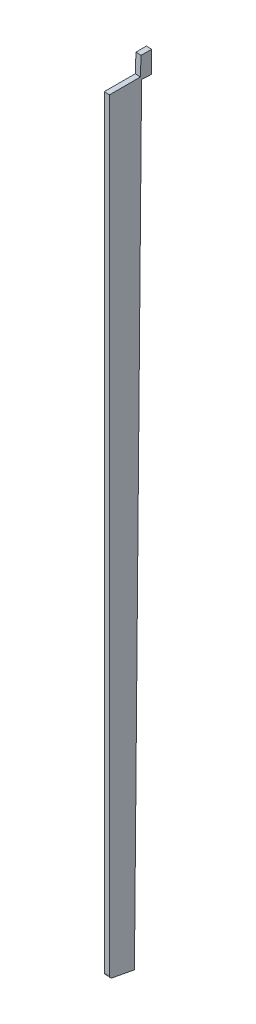
ISO-10303-21;
HEADER;
FILE_DESCRIPTION(('STEP AP214'),'2;1');
FILE_NAME('part.step','',(''),(''),'','','');
FILE_SCHEMA(('AUTOMOTIVE_DESIGN { 1 0 10303 214 1 1 1 1 }'));
ENDSEC;
DATA;
#1=APPLICATION_CONTEXT('core data for automotive mechanical design processes');
#2=APPLICATION_PROTOCOL_DEFINITION('international standard','automotive_design',2000,#1);
#3=PRODUCT_CONTEXT('',#1,'mechanical');
#4=PRODUCT('Part','Part','',(#3));
#5=PRODUCT_RELATED_PRODUCT_CATEGORY('part','',(#4));
#6=PRODUCT_DEFINITION_FORMATION('','',#4);
#7=PRODUCT_DEFINITION_CONTEXT('part definition',#1,'design');
#8=PRODUCT_DEFINITION('design','',#6,#7);
#9=PRODUCT_DEFINITION_SHAPE('','',#8);
#10=(LENGTH_UNIT() NAMED_UNIT(*) SI_UNIT(.MILLI.,.METRE.));
#11=(NAMED_UNIT(*) PLANE_ANGLE_UNIT() SI_UNIT($,.RADIAN.));
#12=(NAMED_UNIT(*) SI_UNIT($,.STERADIAN.) SOLID_ANGLE_UNIT());
#13=UNCERTAINTY_MEASURE_WITH_UNIT(LENGTH_MEASURE(1.E-05),#10,'distance_accuracy_value','');
#14=(GEOMETRIC_REPRESENTATION_CONTEXT(3) GLOBAL_UNCERTAINTY_ASSIGNED_CONTEXT((#13)) GLOBAL_UNIT_ASSIGNED_CONTEXT((#10,
#11,#12)) REPRESENTATION_CONTEXT('',''));
#15=CARTESIAN_POINT('',(0.,0.,0.));
#16=DIRECTION('',(0.,0.,1.));
#17=DIRECTION('',(1.,0.,0.));
#18=AXIS2_PLACEMENT_3D('',#15,#16,#17);
#19=CARTESIAN_POINT('',(184.5006852326,-42.1978786607,121.9738320219));
#20=DIRECTION('',(0.998629534754574,0.,0.0523359562429386));
#21=DIRECTION('',(0.0523359562429386,0.,-0.998629534754574));
#22=AXIS2_PLACEMENT_3D('',#19,#20,#21);
#23=PLANE('',#22);
#24=DIRECTION('',(-0.0522644276887088,-0.0522644276887069,0.997264688634238));
#25=VECTOR('',#24,1.);
#26=CARTESIAN_POINT('',(184.2909007959,34.3922746141211,125.976757533525));
#27=LINE('',#26,#25);
#28=CARTESIAN_POINT('',(184.705212005004,34.8065858232252,118.071228721351));
#29=VERTEX_POINT('',#28);
#30=CARTESIAN_POINT('',(184.656584669788,34.7579584880086,118.999093551379));
#31=VERTEX_POINT('',#30);
#32=EDGE_CURVE('E208',#29,#31,#27,.T.);
#33=ORIENTED_EDGE('',*,*,#32,.F.);
#34=CARTESIAN_POINT('',(184.705211997627,34.8066456225911,118.071228862116));
#35=CARTESIAN_POINT('',(184.705234977646,34.6071108074494,118.070790377229));
#36=CARTESIAN_POINT('',(184.705263006463,34.4075762538389,118.07025555554));
#37=CARTESIAN_POINT('',(184.705314498615,34.0575105145859,118.069273026767));
#38=CARTESIAN_POINT('',(184.705337392663,33.9069792995909,118.068836182293));
#39=CARTESIAN_POINT('',(184.705381483794,33.6059167784652,118.067994873399));
#40=CARTESIAN_POINT('',(184.705402680876,33.4553854723346,118.06759040898));
#41=CARTESIAN_POINT('',(184.705421429006,33.3048540388935,118.067232673347));
#42=B_SPLINE_CURVE_WITH_KNOTS('',3,(#34,#35,#36,#37,#38,#39,#40,#41),.UNSPECIFIED.,.F.,.F.,(4,2,
2,4),(0.,0.598605823472927,1.05020137048312,1.50179692528668),.UNSPECIFIED.);
#43=CARTESIAN_POINT('',(184.705412179008,33.3048539317987,118.067277259925));
#44=VERTEX_POINT('',#43);
#45=EDGE_CURVE('E155',#29,#44,#42,.T.);
#46=ORIENTED_EDGE('',*,*,#45,.T.);
#47=DIRECTION('',(0.000389339365391512,-0.999972328524379,-0.00742903764899957));
#48=VECTOR('',#47,1.);
#49=CARTESIAN_POINT('',(184.705416716509,33.3048562404193,118.067322593144));
#50=LINE('',#49,#48);
#51=CARTESIAN_POINT('',(184.705613281445,32.8,118.063571910736));
#52=VERTEX_POINT('',#51);
#53=EDGE_CURVE('E159',#44,#52,#50,.T.);
#54=ORIENTED_EDGE('',*,*,#53,.T.);
#55=DIRECTION('',(0.0523359562429386,0.,-0.998629534754574));
#56=VECTOR('',#55,1.);
#57=CARTESIAN_POINT('',(184.5006852326,32.8,121.9738320219));
#58=LINE('',#57,#56);
#59=CARTESIAN_POINT('',(184.659027233943,32.8,118.95248665086));
#60=VERTEX_POINT('',#59);
#61=EDGE_CURVE('E161',#60,#52,#58,.T.);
#62=ORIENTED_EDGE('',*,*,#61,.F.);
#63=DIRECTION('',(-0.000464096706949112,-0.999960681658663,0.0088554927016209));
#64=VECTOR('',#63,1.);
#65=CARTESIAN_POINT('',(184.659027233958,32.8000000318263,118.952486650578));
#66=LINE('',#65,#64);
#67=CARTESIAN_POINT('',(184.62601842434,-38.322055507033,119.582332258803));
#68=VERTEX_POINT('',#67);
#69=EDGE_CURVE('E107',#60,#68,#66,.T.);
#70=ORIENTED_EDGE('',*,*,#69,.T.);
#71=CARTESIAN_POINT('',(184.524971554996,-38.0394702416146,121.510421384624));
#72=CARTESIAN_POINT('',(184.536032859543,-38.0707885723955,121.299359120615));
#73=CARTESIAN_POINT('',(184.558266656468,-38.13338679984,120.875113002392));
#74=CARTESIAN_POINT('',(184.591986358834,-38.219733945,120.23170275249));
#75=CARTESIAN_POINT('',(184.61464127806,-38.2871350317664,119.799421142092));
#76=CARTESIAN_POINT('',(184.62601842434,-38.3220555070361,119.582332258796));
#77=(BOUNDED_CURVE() B_SPLINE_CURVE(3,(#71,#72,#73,#74,#75,#76),.UNSPECIFIED.,.F.,
.F.) B_SPLINE_CURVE_WITH_KNOTS((4,1,1,4),(0.02229358542885,0.3410378064515,0.6597820274743,
0.978526248497),
.UNSPECIFIED.) CURVE() GEOMETRIC_REPRESENTATION_ITEM() RATIONAL_B_SPLINE_CURVE((1.,1.,1.,1.,1.,1.)) REPRESENTATION_ITEM(''));
#78=CARTESIAN_POINT('',(184.524971554995,-38.0394702416151,121.510421384632));
#79=VERTEX_POINT('',#78);
#80=EDGE_CURVE('E102',#68,#79,#77,.F.);
#81=ORIENTED_EDGE('',*,*,#80,.T.);
#82=CARTESIAN_POINT('',(184.524971554995,-38.0394702416157,121.510421384639));
#83=CARTESIAN_POINT('',(184.522253685225,-38.0349571997024,121.562281429222));
#84=CARTESIAN_POINT('',(184.51756593088,-38.00267348749,121.651729110631));
#85=CARTESIAN_POINT('',(184.512202509703,-37.89652311706,121.754069283232));
#86=CARTESIAN_POINT('',(184.510688559446,-37.8009331648689,121.782957175014));
#87=CARTESIAN_POINT('',(184.510686590801,-37.7456221817474,121.782994738997));
#88=(BOUNDED_CURVE() B_SPLINE_CURVE(3,(#82,#83,#84,#85,#86,#87),.UNSPECIFIED.,.F.,
.F.) B_SPLINE_CURVE_WITH_KNOTS((4,1,1,4),(0.06048022871664,0.3576335045607,0.6547867804048,
0.9519400562488),
.UNSPECIFIED.) CURVE() GEOMETRIC_REPRESENTATION_ITEM() RATIONAL_B_SPLINE_CURVE((1.,1.,1.,1.,1.,1.)) REPRESENTATION_ITEM(''));
#89=CARTESIAN_POINT('',(184.510687975478,-37.7456221949012,121.782994811565));
#90=VERTEX_POINT('',#89);
#91=EDGE_CURVE('E24',#90,#79,#88,.F.);
#92=ORIENTED_EDGE('',*,*,#91,.F.);
#93=DIRECTION('',(0.,1.,0.));
#94=VECTOR('',#93,1.);
#95=CARTESIAN_POINT('',(184.510689360153,-2.416471475527,121.782994884154));
#96=LINE('',#95,#94);
#97=CARTESIAN_POINT('',(184.51068934373,32.9101379262714,121.782995197519));
#98=VERTEX_POINT('',#97);
#99=EDGE_CURVE('E97',#98,#90,#96,.F.);
#100=ORIENTED_EDGE('',*,*,#99,.F.);
#101=DIRECTION('',(0.0522648305395171,0.0513692926803632,-0.997311176743846));
#102=VECTOR('',#101,1.);
#103=CARTESIAN_POINT('',(184.510689335519,32.9101378941576,121.782995354203));
#104=LINE('',#103,#102);
#105=CARTESIAN_POINT('',(184.653439808862,33.050439894647,119.059087825459));
#106=VERTEX_POINT('',#105);
#107=EDGE_CURVE('E271',#98,#106,#104,.T.);
#108=ORIENTED_EDGE('',*,*,#107,.T.);
#109=DIRECTION('',(0.00184021471466072,0.999381640594566,-0.035113388505222));
#110=VECTOR('',#109,1.);
#111=CARTESIAN_POINT('',(184.655012573321,33.90418619002,119.02909093894));
#112=LINE('',#111,#110);
#113=EDGE_CURVE('E207',#31,#106,#112,.F.);
#114=ORIENTED_EDGE('',*,*,#113,.F.);
#115=EDGE_LOOP('',(#33,#46,#54,#62,#70,#81,#92,#100,#108,#114));
#116=FACE_BOUND('',#115,.T.);
#117=ADVANCED_FACE('F17',(#116),#23,.F.);
#118=CARTESIAN_POINT('',(184.7603418492,-2.416471475527,121.7960785146));
#119=DIRECTION('',(-0.0523355489657193,0.,0.998629556098986));
#120=DIRECTION('',(0.998629556098986,0.,0.0523355489657193));
#121=AXIS2_PLACEMENT_3D('',#118,#119,#120);
#122=PLANE('',#121);
#123=DIRECTION('',(-0.998629534754531,0.,-0.0523359562437616));
#124=VECTOR('',#123,1.);
#125=CARTESIAN_POINT('',(185.482121239688,-37.745622208055,121.833905471646));
#126=LINE('',#125,#124);
#127=CARTESIAN_POINT('',(185.010001366444,-37.7456221949012,121.809162559827));
#128=VERTEX_POINT('',#127);
#129=EDGE_CURVE('E116',#128,#90,#126,.T.);
#130=ORIENTED_EDGE('',*,*,#129,.F.);
#131=DIRECTION('',(0.,1.,0.));
#132=VECTOR('',#131,1.);
#133=CARTESIAN_POINT('',(185.010001391173,-42.1978786607,121.809162087966));
#134=LINE('',#133,#132);
#135=CARTESIAN_POINT('',(185.010001391717,32.9101383063397,121.809162077587));
#136=VERTEX_POINT('',#135);
#137=EDGE_CURVE('E189',#136,#128,#134,.F.);
#138=ORIENTED_EDGE('',*,*,#137,.F.);
#139=DIRECTION('',(-0.998629653231954,-1.60031987662425E-08,-0.052333695510889));
#140=VECTOR('',#139,1.);
#141=CARTESIAN_POINT('',(185.010004162132,32.9101379021592,121.809162201958));
#142=LINE('',#141,#140);
#143=EDGE_CURVE('E272',#136,#98,#142,.T.);
#144=ORIENTED_EDGE('',*,*,#143,.T.);
#145=ORIENTED_EDGE('',*,*,#99,.T.);
#146=EDGE_LOOP('',(#130,#138,#144,#145));
#147=FACE_BOUND('',#146,.T.);
#148=ADVANCED_FACE('F142',(#147),#122,.T.);
#149=CARTESIAN_POINT('',(185.4981130124,-38.04076377608,121.5287642707));
#150=CARTESIAN_POINT('',(185.4975280441,-38.04082561209,121.5399261308));
#151=CARTESIAN_POINT('',(185.4941653883,-38.03824258549,121.6040894249));
#152=CARTESIAN_POINT('',(185.4890005798,-38.00267348749,121.7026398433));
#153=CARTESIAN_POINT('',(185.4836371586,-37.89652311706,121.8049800159));
#154=CARTESIAN_POINT('',(185.4820007793,-37.79320306714,121.8362039924));
#155=CARTESIAN_POINT('',(185.4821403524,-37.72753418651,121.8335407795));
#156=CARTESIAN_POINT('',(185.4821805466,-37.71818973948,121.8327738279));
#157=(BOUNDED_CURVE() B_SPLINE_CURVE(3,(#149,#150,#151,#152,#153,#154,#155,#156),.UNSPECIFIED.,
.F.,.F.) B_SPLINE_CURVE_WITH_KNOTS((4,1,1,1,1,4),(0.,0.06048022871664,0.3576335045607,
0.6547867804048,0.9519400562488,1.),
.UNSPECIFIED.) CURVE() GEOMETRIC_REPRESENTATION_ITEM() RATIONAL_B_SPLINE_CURVE((1.,1.,1.,1.,1.,
1.,1.,1.)) REPRESENTATION_ITEM(''));
#158=DIRECTION('',(-0.998629534754531,0.,-0.0523359562437616));
#159=VECTOR('',#158,1.);
#160=SURFACE_OF_LINEAR_EXTRUSION('',#157,#159);
#161=DIRECTION('',(-0.998629534754072,0.,-0.0523359562525186));
#162=VECTOR('',#161,1.);
#163=CARTESIAN_POINT('',(185.496405624474,-38.0394702416035,121.561332087009));
#164=LINE('',#163,#162);
#165=CARTESIAN_POINT('',(185.024286322392,-38.0394702416091,121.536589362789));
#166=VERTEX_POINT('',#165);
#167=EDGE_CURVE('E111',#79,#166,#164,.F.);
#168=ORIENTED_EDGE('',*,*,#167,.T.);
#169=CARTESIAN_POINT('',(185.024286322394,-38.0394702416157,121.536589362762));
#170=CARTESIAN_POINT('',(185.021568452624,-38.0349571997024,121.588449407345));
#171=CARTESIAN_POINT('',(185.016880698279,-38.00267348749,121.677897088754));
#172=CARTESIAN_POINT('',(185.011517277102,-37.89652311706,121.780237261355));
#173=CARTESIAN_POINT('',(185.010003326845,-37.8009331648689,121.809125153137));
#174=CARTESIAN_POINT('',(185.0100013582,-37.7456221817474,121.80916271712));
#175=(BOUNDED_CURVE() B_SPLINE_CURVE(3,(#169,#170,#171,#172,#173,#174),.UNSPECIFIED.,.F.,
.F.) B_SPLINE_CURVE_WITH_KNOTS((4,1,1,4),(0.06048022871664,0.3576335045607,0.6547867804048,
0.9519400562488),
.UNSPECIFIED.) CURVE() GEOMETRIC_REPRESENTATION_ITEM() RATIONAL_B_SPLINE_CURVE((1.,1.,1.,1.,1.,1.)) REPRESENTATION_ITEM(''));
#176=EDGE_CURVE('E187',#128,#166,#175,.F.);
#177=ORIENTED_EDGE('',*,*,#176,.F.);
#178=ORIENTED_EDGE('',*,*,#129,.T.);
#179=ORIENTED_EDGE('',*,*,#91,.T.);
#180=EDGE_LOOP('',(#168,#177,#178,#179));
#181=FACE_BOUND('',#180,.T.);
#182=ADVANCED_FACE('F113',(#181),#160,.T.);
#183=CARTESIAN_POINT('',(185.4940854914,-38.03289899023,121.6056028629));
#184=CARTESIAN_POINT('',(185.4948585985,-38.03508921872,121.5908511011));
#185=CARTESIAN_POINT('',(185.5066893917,-38.06859945203,121.3651061187));
#186=CARTESIAN_POINT('',(185.5297007259,-38.13338679984,120.9260237047));
#187=CARTESIAN_POINT('',(185.5634204283,-38.219733945,120.2826134548));
#188=CARTESIAN_POINT('',(185.5868384768,-38.28940543244,119.83577047));
#189=CARTESIAN_POINT('',(185.5989856727,-38.32676621855,119.6039881655));
#190=CARTESIAN_POINT('',(185.5997526022,-38.32912950076,119.5893542787));
#191=(BOUNDED_CURVE() B_SPLINE_CURVE(3,(#183,#184,#185,#186,#187,#188,#189,#190),.UNSPECIFIED.,
.F.,.F.) B_SPLINE_CURVE_WITH_KNOTS((4,1,1,1,1,4),(0.,0.02229358542885,0.3410378064515,
0.6597820274743,0.978526248497,1.),
.UNSPECIFIED.) CURVE() GEOMETRIC_REPRESENTATION_ITEM() RATIONAL_B_SPLINE_CURVE((1.,1.,1.,1.,1.,
1.,1.,1.)) REPRESENTATION_ITEM(''));
#192=DIRECTION('',(-0.998629534754072,0.,-0.0523359562525186));
#193=VECTOR('',#192,1.);
#194=SURFACE_OF_LINEAR_EXTRUSION('',#191,#193);
#195=ORIENTED_EDGE('',*,*,#80,.F.);
#196=DIRECTION('',(0.998629534754575,0.,0.0523359562429296));
#197=VECTOR('',#196,1.);
#198=CARTESIAN_POINT('',(184.875675808098,-38.3220555070299,119.595416247876));
#199=LINE('',#198,#197);
#200=CARTESIAN_POINT('',(185.125333191736,-38.3220555070299,119.608500236968));
#201=VERTEX_POINT('',#200);
#202=EDGE_CURVE('E122',#68,#201,#199,.T.);
#203=ORIENTED_EDGE('',*,*,#202,.T.);
#204=CARTESIAN_POINT('',(185.024286322394,-38.0394702416146,121.536589362751));
#205=CARTESIAN_POINT('',(185.035347626942,-38.0707885723955,121.325527098742));
#206=CARTESIAN_POINT('',(185.057581423867,-38.13338679984,120.901280980519));
#207=CARTESIAN_POINT('',(185.091301126232,-38.219733945,120.257870730617));
#208=CARTESIAN_POINT('',(185.113956045458,-38.2871350317664,119.82558912022));
#209=CARTESIAN_POINT('',(185.125333191739,-38.3220555070361,119.608500236923));
#210=(BOUNDED_CURVE() B_SPLINE_CURVE(3,(#204,#205,#206,#207,#208,#209),.UNSPECIFIED.,.F.,
.F.) B_SPLINE_CURVE_WITH_KNOTS((4,1,1,4),(0.02229358542885,0.3410378064515,0.6597820274743,
0.978526248497),
.UNSPECIFIED.) CURVE() GEOMETRIC_REPRESENTATION_ITEM() RATIONAL_B_SPLINE_CURVE((1.,1.,1.,1.,1.,1.)) REPRESENTATION_ITEM(''));
#211=EDGE_CURVE('E119',#166,#201,#210,.T.);
#212=ORIENTED_EDGE('',*,*,#211,.F.);
#213=ORIENTED_EDGE('',*,*,#167,.F.);
#214=EDGE_LOOP('',(#195,#203,#212,#213));
#215=FACE_BOUND('',#214,.T.);
#216=ADVANCED_FACE('F117',(#215),#194,.F.);
#217=CARTESIAN_POINT('',(184.8921802129,-2.761027753517,119.2804934439));
#218=DIRECTION('',(-0.0523338984799378,0.00886764550158963,0.998590270297658));
#219=DIRECTION('',(0.998629534754575,0.,0.0523359562429296));
#220=AXIS2_PLACEMENT_3D('',#217,#218,#219);
#221=PLANE('',#220);
#222=ORIENTED_EDGE('',*,*,#69,.F.);
#223=DIRECTION('',(-0.998629534754575,0.,-0.0523359562429296));
#224=VECTOR('',#223,1.);
#225=CARTESIAN_POINT('',(184.908675023292,32.8,118.965570137103));
#226=LINE('',#225,#224);
#227=CARTESIAN_POINT('',(185.158342095264,32.8,118.978652836855));
#228=VERTEX_POINT('',#227);
#229=EDGE_CURVE('E166',#228,#60,#226,.T.);
#230=ORIENTED_EDGE('',*,*,#229,.F.);
#231=DIRECTION('',(0.000464099347821621,0.999960681211183,-0.0088555430924672));
#232=VECTOR('',#231,1.);
#233=CARTESIAN_POINT('',(185.125333191735,-38.32205550703,119.608500237002));
#234=LINE('',#233,#232);
#235=EDGE_CURVE('E177',#201,#228,#234,.T.);
#236=ORIENTED_EDGE('',*,*,#235,.F.);
#237=ORIENTED_EDGE('',*,*,#202,.F.);
#238=EDGE_LOOP('',(#222,#230,#236,#237));
#239=FACE_BOUND('',#238,.T.);
#240=ADVANCED_FACE('F178',(#239),#221,.F.);
#241=CARTESIAN_POINT('',(184.9319968596,32.8,118.5205629907));
#242=DIRECTION('',(0.,-1.,0.));
#243=DIRECTION('',(0.,0.,-1.));
#244=AXIS2_PLACEMENT_3D('',#241,#242,#243);
#245=PLANE('',#244);
#246=DIRECTION('',(0.998629534754575,0.,0.0523359562429131));
#247=VECTOR('',#246,1.);
#248=CARTESIAN_POINT('',(184.705602833475,32.8,118.063571380626));
#249=LINE('',#248,#247);
#250=CARTESIAN_POINT('',(185.204928048844,32.8,118.089739888859));
#251=VERTEX_POINT('',#250);
#252=EDGE_CURVE('E157',#52,#251,#249,.T.);
#253=ORIENTED_EDGE('',*,*,#252,.T.);
#254=DIRECTION('',(0.0523359562429386,0.,-0.998629534754574));
#255=VECTOR('',#254,1.);
#256=CARTESIAN_POINT('',(185.,32.8,122.));
#257=LINE('',#256,#255);
#258=EDGE_CURVE('E182',#228,#251,#257,.T.);
#259=ORIENTED_EDGE('',*,*,#258,.F.);
#260=ORIENTED_EDGE('',*,*,#229,.T.);
#261=ORIENTED_EDGE('',*,*,#61,.T.);
#262=EDGE_LOOP('',(#253,#259,#260,#261));
#263=FACE_BOUND('',#262,.T.);
#264=ADVANCED_FACE('F231',(#263),#245,.T.);
#265=CARTESIAN_POINT('',(184.9551723842,33.05242549471,118.0785312128));
#266=DIRECTION('',(-0.0523345080297926,-0.00743923285909537,0.998601901201749));
#267=DIRECTION('',(0.998629534754575,0.,0.0523359562429299));
#268=AXIS2_PLACEMENT_3D('',#265,#266,#267);
#269=PLANE('',#268);
#270=ORIENTED_EDGE('',*,*,#53,.F.);
#271=CARTESIAN_POINT('',(185.204196270015,33.304822060983,118.09621442017));
#272=CARTESIAN_POINT('',(185.1834546616,33.3048227812804,118.095212920198));
#273=CARTESIAN_POINT('',(185.162716045227,33.3048236498265,118.094152182472));
#274=CARTESIAN_POINT('',(185.121211269626,33.3048256209361,118.091936090922));
#275=CARTESIAN_POINT('',(185.100445118143,33.3048267238641,118.090780591486));
#276=CARTESIAN_POINT('',(185.058892821848,33.304829099966,118.088400765109));
#277=CARTESIAN_POINT('',(185.038106681537,33.3048303733344,118.087176360477));
#278=CARTESIAN_POINT('',(184.996521870486,33.3048330267631,118.084684422748));
#279=CARTESIAN_POINT('',(184.975723201592,33.3048344069,118.083416859018));
#280=CARTESIAN_POINT('',(184.934120817945,33.3048372101856,118.08086435341));
#281=CARTESIAN_POINT('',(184.913317103501,33.3048386333468,118.079579406548));
#282=CARTESIAN_POINT('',(184.871712110347,33.3048414589702,118.077017897471));
#283=CARTESIAN_POINT('',(184.850910831709,33.3048428614353,118.075741334097));
#284=CARTESIAN_POINT('',(184.809318176381,33.3048455818789,118.073222385249));
#285=CARTESIAN_POINT('',(184.788526800868,33.3048468999055,118.071979980561));
#286=CARTESIAN_POINT('',(184.746961454979,33.3048493876931,118.069555140487));
#287=CARTESIAN_POINT('',(184.726187488021,33.3048505576013,118.068372646297));
#288=CARTESIAN_POINT('',(184.705411134287,33.3048516225367,118.067232102098));
#289=B_SPLINE_CURVE_WITH_KNOTS('',3,(#271,#272,#273,#274,#275,#276,#277,#278,#279,#280,#281,
#282,#283,#284,#285,#286,#287,#288),.UNSPECIFIED.,.F.,.F.,(4,2,2,2,2,2,2,2,4),(0.,
0.0622970467911405,0.124691681322449,0.18715813351373,0.249669888622733,0.312199967561254,
0.374721204234902,0.437206521685863,0.49962927045745),.UNSPECIFIED.);
#290=CARTESIAN_POINT('',(185.204383147633,33.3048387861642,118.094918900468));
#291=VERTEX_POINT('',#290);
#292=EDGE_CURVE('E212',#44,#291,#289,.F.);
#293=ORIENTED_EDGE('',*,*,#292,.T.);
#294=DIRECTION('',(-0.000389339365394646,0.999972328524379,0.00742903764900935));
#295=VECTOR('',#294,1.);
#296=CARTESIAN_POINT('',(185.204829767854,33.05242549471,118.091615201859));
#297=LINE('',#296,#295);
#298=EDGE_CURVE('E252',#251,#291,#297,.T.);
#299=ORIENTED_EDGE('',*,*,#298,.F.);
#300=ORIENTED_EDGE('',*,*,#252,.F.);
#301=EDGE_LOOP('',(#270,#293,#299,#300));
#302=FACE_BOUND('',#301,.T.);
#303=ADVANCED_FACE('F227',(#302),#269,.F.);
#304=CARTESIAN_POINT('',(185.2486398795,33.26085980376,118.0975058191));
#305=CARTESIAN_POINT('',(185.0724304309,33.26085367511,118.0898207897));
#306=CARTESIAN_POINT('',(184.8759014686,33.26086012844,118.0761472513));
#307=CARTESIAN_POINT('',(184.6802830875,33.26085809907,118.0657825965));
#308=CARTESIAN_POINT('',(184.6613423377,33.26085783688,118.0648042599));
#309=CARTESIAN_POINT('',(185.2486986428,33.27552398018,118.0977813673));
#310=CARTESIAN_POINT('',(185.0724981141,33.27551885776,118.0900865674));
#311=CARTESIAN_POINT('',(184.8759109476,33.27552670037,118.0762407603));
#312=CARTESIAN_POINT('',(184.6802779833,33.27552588398,118.0658072816));
#313=CARTESIAN_POINT('',(184.6613361582,33.27552573793,118.0648230788));
#314=CARTESIAN_POINT('',(185.2507332518,33.79073385867,118.1068203365));
#315=CARTESIAN_POINT('',(185.0748412007,33.79076449938,118.0986769995));
#316=CARTESIAN_POINT('',(184.8762384872,33.7908186946,118.0794083799));
#317=CARTESIAN_POINT('',(184.68010023,33.79085990343,118.0667084001));
#318=CARTESIAN_POINT('',(184.6611211436,33.79086379451,118.0655290758));
#319=CARTESIAN_POINT('',(185.250737814,34.32067872948,118.086299945));
#320=CARTESIAN_POINT('',(185.0748207196,34.3207645627,118.0728072735));
#321=CARTESIAN_POINT('',(184.876192607,34.32075627902,118.0772003106));
#322=CARTESIAN_POINT('',(184.6800274577,34.32081419642,118.0692063825));
#323=CARTESIAN_POINT('',(184.661045755,34.32082031843,118.0683362693));
#324=CARTESIAN_POINT('',(185.2487173427,34.83580324316,118.1001249778));
#325=CARTESIAN_POINT('',(185.0724439315,34.83591765818,118.0869685599));
#326=CARTESIAN_POINT('',(184.8757768082,34.83599866182,118.0812451478));
#327=CARTESIAN_POINT('',(184.6800634115,34.83610893517,118.0698551658));
#328=CARTESIAN_POINT('',(184.661113792,34.83611984276,118.0687080897));
#329=CARTESIAN_POINT('',(185.2486591458,34.85042458054,118.1005375824));
#330=CARTESIAN_POINT('',(185.072375482,34.85053979219,118.087394019));
#331=CARTESIAN_POINT('',(184.8757648507,34.85062341778,118.0813636588));
#332=CARTESIAN_POINT('',(184.6800644766,34.8507351983,118.069872517));
#333=CARTESIAN_POINT('',(184.6611157823,34.85074624326,118.0687172342));
#334=B_SPLINE_SURFACE_WITH_KNOTS('',3,3,((#304,#305,#306,#307,#308),(#309,#310,#311,#312,#313),
(#314,#315,#316,#317,#318),(#319,#320,#321,#322,#323),(#324,#325,#326,#327,#328),(#329,#330,
#331,#332,#333)),.UNSPECIFIED.,.F.,.F.,.F.,(4,1,1,4),(4,1,4),(-0.02929413289653,
6.64995310578E-06,1.000151973221,1.029369678217),(-0.09467557252025,0.974218853325,
1.088857010258),.UNSPECIFIED.);
#335=CARTESIAN_POINT('',(185.204304714584,34.806646909622,118.096216262626));
#336=CARTESIAN_POINT('',(185.154524900832,34.8066849619756,118.092879336734));
#337=CARTESIAN_POINT('',(185.104715081614,34.8066922535285,118.09012940147));
#338=CARTESIAN_POINT('',(185.005068028009,34.806676830193,118.085202223755));
#339=CARTESIAN_POINT('',(184.955230794836,34.8066541165397,118.083024957735));
#340=CARTESIAN_POINT('',(184.838651536997,34.8066027463983,118.077898190605));
#341=CARTESIAN_POINT('',(184.771909939911,34.8065746876972,118.074937274121));
#342=CARTESIAN_POINT('',(184.705205988211,34.8065858237183,118.071228396589));
#343=B_SPLINE_CURVE_WITH_KNOTS('',3,(#335,#336,#337,#338,#339,#340,#341,#342),.UNSPECIFIED.,.F.,
.F.,(4,2,2,4),(0.,0.149658648957129,0.299311137933607,0.499729542112413),.UNSPECIFIED.);
#344=CARTESIAN_POINT('',(185.204264117046,34.8065867450851,118.096820943178));
#345=VERTEX_POINT('',#344);
#346=EDGE_CURVE('E210',#345,#29,#343,.T.);
#347=CARTESIAN_POINT('',(185.204587745424,33.3048188482719,118.09623326493));
#348=CARTESIAN_POINT('',(185.204427927384,33.5043851805707,118.099282774808));
#349=CARTESIAN_POINT('',(185.204499382184,33.7039438827741,118.097919335988));
#350=CARTESIAN_POINT('',(185.204678896795,34.0540047677209,118.094493993163));
#351=CARTESIAN_POINT('',(185.204773642482,34.2045085320255,118.092686137751));
#352=CARTESIAN_POINT('',(185.204826324324,34.5055416879764,118.091680908321));
#353=CARTESIAN_POINT('',(185.204784236477,34.6560710794871,118.092483992281));
#354=CARTESIAN_POINT('',(185.204587700395,34.8066017848063,118.096234124127));
#355=B_SPLINE_CURVE_WITH_KNOTS('',3,(#347,#348,#349,#350,#351,#352,#353,#354),.UNSPECIFIED.,.F.,
.F.,(4,2,2,4),(0.,0.59868012816035,1.05020901306683,1.50181710362485),.UNSPECIFIED.);
#356=EDGE_CURVE('E247',#291,#345,#355,.T.);
#357=ORIENTED_EDGE('',*,*,#45,.F.);
#358=ORIENTED_EDGE('',*,*,#346,.F.);
#359=ORIENTED_EDGE('',*,*,#356,.F.);
#360=ORIENTED_EDGE('',*,*,#292,.F.);
#361=EDGE_LOOP('',(#357,#358,#359,#360));
#362=FACE_BOUND('',#361,.T.);
#363=ADVANCED_FACE('F19',(#362),#334,.F.);
#364=CARTESIAN_POINT('',(184.9304034694,34.78211990396,118.5511502601));
#365=DIRECTION('',(-0.00273530880057787,0.998633280838553,0.0521928011069875));
#366=DIRECTION('',(0.,-0.0521929963591139,0.998637016703796));
#367=AXIS2_PLACEMENT_3D('',#364,#365,#366);
#368=PLANE('',#367);
#369=DIRECTION('',(-0.998629534754575,0.,-0.052335956242926));
#370=VECTOR('',#369,1.);
#371=CARTESIAN_POINT('',(184.906242053466,34.7579584880086,119.012177540439));
#372=LINE('',#371,#370);
#373=CARTESIAN_POINT('',(185.155899423743,34.7579584745648,119.025261786024));
#374=VERTEX_POINT('',#373);
#375=EDGE_CURVE('E201',#374,#31,#372,.T.);
#376=ORIENTED_EDGE('',*,*,#375,.F.);
#377=DIRECTION('',(-0.0522644276887088,-0.0522644276887069,0.997264688634238));
#378=VECTOR('',#377,1.);
#379=CARTESIAN_POINT('',(184.7902155633,34.3922746141223,126.002925511625));
#380=LINE('',#379,#378);
#381=EDGE_CURVE('E239',#345,#374,#380,.T.);
#382=ORIENTED_EDGE('',*,*,#381,.F.);
#383=ORIENTED_EDGE('',*,*,#346,.T.);
#384=ORIENTED_EDGE('',*,*,#32,.T.);
#385=EDGE_LOOP('',(#376,#382,#383,#384));
#386=FACE_BOUND('',#385,.T.);
#387=ADVANCED_FACE('F219',(#386),#368,.T.);
#388=CARTESIAN_POINT('',(184.904669957,33.90418619002,119.042174928));
#389=DIRECTION('',(-0.0523035938121408,0.0351615762234105,0.998012022789215));
#390=DIRECTION('',(0.998629534754575,0.,0.052335956242926));
#391=AXIS2_PLACEMENT_3D('',#388,#389,#390);
#392=PLANE('',#391);
#393=DIRECTION('',(0.998629625207778,-1.15407822183458E-08,0.052334230264442));
#394=VECTOR('',#393,1.);
#395=CARTESIAN_POINT('',(184.65343772301,33.0504403426876,119.059087884536));
#396=LINE('',#395,#394);
#397=CARTESIAN_POINT('',(185.152753222549,33.0504396007945,119.085255139655));
#398=VERTEX_POINT('',#397);
#399=EDGE_CURVE('E41',#106,#398,#396,.T.);
#400=ORIENTED_EDGE('',*,*,#399,.T.);
#401=DIRECTION('',(-0.00184018736444522,-0.999381658980868,0.0351128666319179));
#402=VECTOR('',#401,1.);
#403=CARTESIAN_POINT('',(185.155899397277,34.75795138906,119.02526229102));
#404=LINE('',#403,#402);
#405=EDGE_CURVE('E32',#374,#398,#404,.T.);
#406=ORIENTED_EDGE('',*,*,#405,.F.);
#407=ORIENTED_EDGE('',*,*,#375,.T.);
#408=ORIENTED_EDGE('',*,*,#113,.T.);
#409=EDGE_LOOP('',(#400,#406,#407,#408));
#410=FACE_BOUND('',#409,.T.);
#411=ADVANCED_FACE('F224',(#410),#392,.T.);
#412=CARTESIAN_POINT('',(184.8317042143,32.98027678874,120.434364277));
#413=DIRECTION('',(0.00268836088190792,-0.998679726323469,-0.0512988980997584));
#414=DIRECTION('',(0.,0.0512990834766219,-0.99868333521415));
#415=AXIS2_PLACEMENT_3D('',#412,#413,#414);
#416=PLANE('',#415);
#417=ORIENTED_EDGE('',*,*,#107,.F.);
#418=ORIENTED_EDGE('',*,*,#143,.F.);
#419=DIRECTION('',(-0.0522668607641804,-0.0513684358393801,0.997311114479967));
#420=VECTOR('',#419,1.);
#421=CARTESIAN_POINT('',(185.152755309705,33.05043860294,119.085255055738));
#422=LINE('',#421,#420);
#423=EDGE_CURVE('E11',#398,#136,#422,.T.);
#424=ORIENTED_EDGE('',*,*,#423,.F.);
#425=ORIENTED_EDGE('',*,*,#399,.F.);
#426=EDGE_LOOP('',(#417,#418,#424,#425));
#427=FACE_BOUND('',#426,.T.);
#428=ADVANCED_FACE('F262',(#427),#416,.F.);
#429=CARTESIAN_POINT('',(185.,-42.1978786607,122.));
#430=DIRECTION('',(0.998629534754574,0.,0.0523359562429386));
#431=DIRECTION('',(0.0523359562429386,0.,-0.998629534754574));
#432=AXIS2_PLACEMENT_3D('',#429,#430,#431);
#433=PLANE('',#432);
#434=ORIENTED_EDGE('',*,*,#405,.T.);
#435=ORIENTED_EDGE('',*,*,#423,.T.);
#436=ORIENTED_EDGE('',*,*,#137,.T.);
#437=ORIENTED_EDGE('',*,*,#176,.T.);
#438=ORIENTED_EDGE('',*,*,#211,.T.);
#439=ORIENTED_EDGE('',*,*,#235,.T.);
#440=ORIENTED_EDGE('',*,*,#258,.T.);
#441=ORIENTED_EDGE('',*,*,#298,.T.);
#442=ORIENTED_EDGE('',*,*,#356,.T.);
#443=ORIENTED_EDGE('',*,*,#381,.T.);
#444=EDGE_LOOP('',(#434,#435,#436,#437,#438,#439,#440,#441,#442,#443));
#445=FACE_BOUND('',#444,.T.);
#446=ADVANCED_FACE('F185',(#445),#433,.T.);
#447=CLOSED_SHELL('',(#117,#148,#182,#216,#240,#264,#303,#363,#387,#411,#428,#446));
#448=MANIFOLD_SOLID_BREP('B1',#447);
#449=ADVANCED_BREP_SHAPE_REPRESENTATION('',(#18,#448),#14);
#450=SHAPE_DEFINITION_REPRESENTATION(#9,#449);
ENDSEC;
END-ISO-10303-21;
